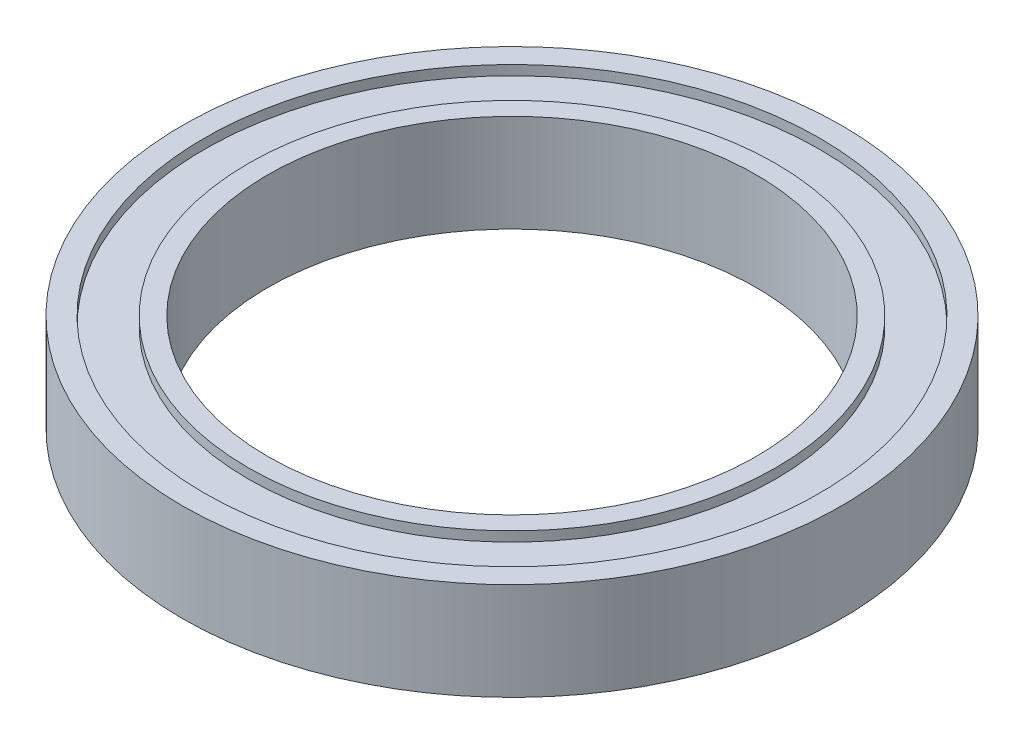
ISO-10303-21;
HEADER;
FILE_DESCRIPTION(('STEP AP214'),'2;1');
FILE_NAME('part.step','',(''),(''),'','','');
FILE_SCHEMA(('AUTOMOTIVE_DESIGN { 1 0 10303 214 1 1 1 1 }'));
ENDSEC;
DATA;
#1=APPLICATION_CONTEXT('core data for automotive mechanical design processes');
#2=APPLICATION_PROTOCOL_DEFINITION('international standard','automotive_design',2000,#1);
#3=PRODUCT_CONTEXT('',#1,'mechanical');
#4=PRODUCT('Part','Part','',(#3));
#5=PRODUCT_RELATED_PRODUCT_CATEGORY('part','',(#4));
#6=PRODUCT_DEFINITION_FORMATION('','',#4);
#7=PRODUCT_DEFINITION_CONTEXT('part definition',#1,'design');
#8=PRODUCT_DEFINITION('design','',#6,#7);
#9=PRODUCT_DEFINITION_SHAPE('','',#8);
#10=(LENGTH_UNIT() NAMED_UNIT(*) SI_UNIT(.MILLI.,.METRE.));
#11=(NAMED_UNIT(*) PLANE_ANGLE_UNIT() SI_UNIT($,.RADIAN.));
#12=(NAMED_UNIT(*) SI_UNIT($,.STERADIAN.) SOLID_ANGLE_UNIT());
#13=UNCERTAINTY_MEASURE_WITH_UNIT(LENGTH_MEASURE(1.E-05),#10,'distance_accuracy_value','');
#14=(GEOMETRIC_REPRESENTATION_CONTEXT(3) GLOBAL_UNCERTAINTY_ASSIGNED_CONTEXT((#13)) GLOBAL_UNIT_ASSIGNED_CONTEXT((#10,
#11,#12)) REPRESENTATION_CONTEXT('',''));
#15=CARTESIAN_POINT('',(0.,0.,0.));
#16=DIRECTION('',(0.,0.,1.));
#17=DIRECTION('',(1.,0.,0.));
#18=AXIS2_PLACEMENT_3D('',#15,#16,#17);
#19=CARTESIAN_POINT('',(0.,0.,0.));
#20=DIRECTION('',(0.,1.,0.));
#21=DIRECTION('',(0.,0.,1.));
#22=AXIS2_PLACEMENT_3D('',#19,#20,#21);
#23=PLANE('',#22);
#24=CARTESIAN_POINT('',(0.,0.,0.));
#25=DIRECTION('',(0.,1.,0.));
#26=DIRECTION('',(0.,0.,1.));
#27=AXIS2_PLACEMENT_3D('',#24,#25,#26);
#28=CIRCLE('',#27,10.);
#29=CARTESIAN_POINT('',(0.,0.,10.));
#30=VERTEX_POINT('',#29);
#31=EDGE_CURVE('E47',#30,#30,#28,.T.);
#32=ORIENTED_EDGE('',*,*,#31,.T.);
#33=EDGE_LOOP('',(#32));
#34=FACE_BOUND('',#33,.T.);
#35=CARTESIAN_POINT('',(0.,0.,0.));
#36=DIRECTION('',(0.,1.,0.));
#37=DIRECTION('',(0.,0.,1.));
#38=AXIS2_PLACEMENT_3D('',#35,#36,#37);
#39=CIRCLE('',#38,10.8);
#40=CARTESIAN_POINT('',(0.,0.,10.8));
#41=VERTEX_POINT('',#40);
#42=EDGE_CURVE('E71',#41,#41,#39,.T.);
#43=ORIENTED_EDGE('',*,*,#42,.F.);
#44=EDGE_LOOP('',(#43));
#45=FACE_BOUND('',#44,.T.);
#46=ADVANCED_FACE('F34',(#34,#45),#23,.F.);
#47=CARTESIAN_POINT('',(0.,4.,0.));
#48=DIRECTION('',(0.,1.,0.));
#49=DIRECTION('',(0.,0.,1.));
#50=AXIS2_PLACEMENT_3D('',#47,#48,#49);
#51=PLANE('',#50);
#52=CARTESIAN_POINT('',(0.,4.,0.));
#53=DIRECTION('',(0.,1.,0.));
#54=DIRECTION('',(0.,0.,1.));
#55=AXIS2_PLACEMENT_3D('',#52,#53,#54);
#56=CIRCLE('',#55,10.);
#57=CARTESIAN_POINT('',(0.,4.,10.));
#58=VERTEX_POINT('',#57);
#59=EDGE_CURVE('E45',#58,#58,#56,.T.);
#60=ORIENTED_EDGE('',*,*,#59,.F.);
#61=EDGE_LOOP('',(#60));
#62=FACE_BOUND('',#61,.T.);
#63=CARTESIAN_POINT('',(0.,4.,0.));
#64=DIRECTION('',(0.,1.,0.));
#65=DIRECTION('',(0.,0.,1.));
#66=AXIS2_PLACEMENT_3D('',#63,#64,#65);
#67=CIRCLE('',#66,10.8);
#68=CARTESIAN_POINT('',(0.,4.,10.8));
#69=VERTEX_POINT('',#68);
#70=EDGE_CURVE('E59',#69,#69,#67,.T.);
#71=ORIENTED_EDGE('',*,*,#70,.T.);
#72=EDGE_LOOP('',(#71));
#73=FACE_BOUND('',#72,.T.);
#74=ADVANCED_FACE('F87',(#62,#73),#51,.T.);
#75=CARTESIAN_POINT('',(0.,4.,0.));
#76=DIRECTION('',(0.,1.,0.));
#77=DIRECTION('',(0.,0.,1.));
#78=AXIS2_PLACEMENT_3D('',#75,#76,#77);
#79=CIRCLE('',#78,12.6);
#80=CARTESIAN_POINT('',(0.,4.,12.6));
#81=VERTEX_POINT('',#80);
#82=EDGE_CURVE('E53',#81,#81,#79,.T.);
#83=ORIENTED_EDGE('',*,*,#82,.F.);
#84=EDGE_LOOP('',(#83));
#85=FACE_BOUND('',#84,.T.);
#86=CARTESIAN_POINT('',(0.,4.,0.));
#87=DIRECTION('',(0.,1.,0.));
#88=DIRECTION('',(0.,0.,1.));
#89=AXIS2_PLACEMENT_3D('',#86,#87,#88);
#90=CIRCLE('',#89,13.5);
#91=CARTESIAN_POINT('',(0.,4.,13.5));
#92=VERTEX_POINT('',#91);
#93=EDGE_CURVE('E10',#92,#92,#90,.T.);
#94=ORIENTED_EDGE('',*,*,#93,.T.);
#95=EDGE_LOOP('',(#94));
#96=FACE_BOUND('',#95,.T.);
#97=ADVANCED_FACE('F93',(#85,#96),#51,.T.);
#98=CARTESIAN_POINT('',(0.,0.,0.));
#99=DIRECTION('',(0.,1.,0.));
#100=DIRECTION('',(0.,0.,1.));
#101=AXIS2_PLACEMENT_3D('',#98,#99,#100);
#102=CIRCLE('',#101,12.6);
#103=CARTESIAN_POINT('',(0.,0.,12.6));
#104=VERTEX_POINT('',#103);
#105=EDGE_CURVE('E65',#104,#104,#102,.T.);
#106=ORIENTED_EDGE('',*,*,#105,.T.);
#107=EDGE_LOOP('',(#106));
#108=FACE_BOUND('',#107,.T.);
#109=CARTESIAN_POINT('',(0.,0.,0.));
#110=DIRECTION('',(0.,1.,0.));
#111=DIRECTION('',(0.,0.,1.));
#112=AXIS2_PLACEMENT_3D('',#109,#110,#111);
#113=CIRCLE('',#112,13.5);
#114=CARTESIAN_POINT('',(0.,0.,13.5));
#115=VERTEX_POINT('',#114);
#116=EDGE_CURVE('E38',#115,#115,#113,.T.);
#117=ORIENTED_EDGE('',*,*,#116,.F.);
#118=EDGE_LOOP('',(#117));
#119=FACE_BOUND('',#118,.T.);
#120=ADVANCED_FACE('F89',(#108,#119),#23,.F.);
#121=CARTESIAN_POINT('',(0.,4.,0.));
#122=DIRECTION('',(0.,-1.,0.));
#123=DIRECTION('',(0.,0.,-1.));
#124=AXIS2_PLACEMENT_3D('',#121,#122,#123);
#125=CYLINDRICAL_SURFACE('',#124,13.5);
#126=ORIENTED_EDGE('',*,*,#93,.F.);
#127=EDGE_LOOP('',(#126));
#128=FACE_BOUND('',#127,.T.);
#129=ORIENTED_EDGE('',*,*,#116,.T.);
#130=EDGE_LOOP('',(#129));
#131=FACE_BOUND('',#130,.T.);
#132=ADVANCED_FACE('F36',(#128,#131),#125,.T.);
#133=CARTESIAN_POINT('',(0.,4.,0.));
#134=DIRECTION('',(0.,-1.,0.));
#135=DIRECTION('',(0.,0.,-1.));
#136=AXIS2_PLACEMENT_3D('',#133,#134,#135);
#137=CYLINDRICAL_SURFACE('',#136,10.);
#138=ORIENTED_EDGE('',*,*,#59,.T.);
#139=EDGE_LOOP('',(#138));
#140=FACE_BOUND('',#139,.T.);
#141=ORIENTED_EDGE('',*,*,#31,.F.);
#142=EDGE_LOOP('',(#141));
#143=FACE_BOUND('',#142,.T.);
#144=ADVANCED_FACE('F102',(#140,#143),#137,.F.);
#145=CARTESIAN_POINT('',(0.,3.6,0.));
#146=DIRECTION('',(0.,1.,0.));
#147=DIRECTION('',(0.,0.,1.));
#148=AXIS2_PLACEMENT_3D('',#145,#146,#147);
#149=CYLINDRICAL_SURFACE('',#148,12.6);
#150=CARTESIAN_POINT('',(0.,3.6,0.));
#151=DIRECTION('',(0.,1.,0.));
#152=DIRECTION('',(0.,0.,1.));
#153=AXIS2_PLACEMENT_3D('',#150,#151,#152);
#154=CIRCLE('',#153,12.6);
#155=CARTESIAN_POINT('',(0.,3.6,12.6));
#156=VERTEX_POINT('',#155);
#157=EDGE_CURVE('E50',#156,#156,#154,.T.);
#158=ORIENTED_EDGE('',*,*,#157,.F.);
#159=EDGE_LOOP('',(#158));
#160=FACE_BOUND('',#159,.T.);
#161=ORIENTED_EDGE('',*,*,#82,.T.);
#162=EDGE_LOOP('',(#161));
#163=FACE_BOUND('',#162,.T.);
#164=ADVANCED_FACE('F126',(#160,#163),#149,.F.);
#165=CARTESIAN_POINT('',(0.,3.6,0.));
#166=DIRECTION('',(0.,1.,0.));
#167=DIRECTION('',(0.,0.,1.));
#168=AXIS2_PLACEMENT_3D('',#165,#166,#167);
#169=PLANE('',#168);
#170=CARTESIAN_POINT('',(0.,3.6,0.));
#171=DIRECTION('',(0.,1.,0.));
#172=DIRECTION('',(0.,0.,1.));
#173=AXIS2_PLACEMENT_3D('',#170,#171,#172);
#174=CIRCLE('',#173,10.8);
#175=CARTESIAN_POINT('',(0.,3.6,10.8));
#176=VERTEX_POINT('',#175);
#177=EDGE_CURVE('E56',#176,#176,#174,.T.);
#178=ORIENTED_EDGE('',*,*,#177,.F.);
#179=EDGE_LOOP('',(#178));
#180=FACE_BOUND('',#179,.T.);
#181=ORIENTED_EDGE('',*,*,#157,.T.);
#182=EDGE_LOOP('',(#181));
#183=FACE_BOUND('',#182,.T.);
#184=ADVANCED_FACE('F122',(#180,#183),#169,.T.);
#185=CARTESIAN_POINT('',(0.,3.6,0.));
#186=DIRECTION('',(0.,1.,0.));
#187=DIRECTION('',(0.,0.,1.));
#188=AXIS2_PLACEMENT_3D('',#185,#186,#187);
#189=CYLINDRICAL_SURFACE('',#188,10.8);
#190=ORIENTED_EDGE('',*,*,#177,.T.);
#191=EDGE_LOOP('',(#190));
#192=FACE_BOUND('',#191,.T.);
#193=ORIENTED_EDGE('',*,*,#70,.F.);
#194=EDGE_LOOP('',(#193));
#195=FACE_BOUND('',#194,.T.);
#196=ADVANCED_FACE('F116',(#192,#195),#189,.T.);
#197=CARTESIAN_POINT('',(0.,0.4,0.));
#198=DIRECTION('',(0.,-1.,0.));
#199=DIRECTION('',(0.,0.,1.));
#200=AXIS2_PLACEMENT_3D('',#197,#198,#199);
#201=PLANE('',#200);
#202=CARTESIAN_POINT('',(0.,0.4,0.));
#203=DIRECTION('',(0.,1.,0.));
#204=DIRECTION('',(0.,0.,1.));
#205=AXIS2_PLACEMENT_3D('',#202,#203,#204);
#206=CIRCLE('',#205,12.6);
#207=CARTESIAN_POINT('',(0.,0.4,12.6));
#208=VERTEX_POINT('',#207);
#209=EDGE_CURVE('E62',#208,#208,#206,.T.);
#210=ORIENTED_EDGE('',*,*,#209,.F.);
#211=EDGE_LOOP('',(#210));
#212=FACE_BOUND('',#211,.T.);
#213=CARTESIAN_POINT('',(0.,0.4,0.));
#214=DIRECTION('',(0.,1.,0.));
#215=DIRECTION('',(0.,0.,1.));
#216=AXIS2_PLACEMENT_3D('',#213,#214,#215);
#217=CIRCLE('',#216,10.8);
#218=CARTESIAN_POINT('',(0.,0.4,10.8));
#219=VERTEX_POINT('',#218);
#220=EDGE_CURVE('E68',#219,#219,#217,.T.);
#221=ORIENTED_EDGE('',*,*,#220,.T.);
#222=EDGE_LOOP('',(#221));
#223=FACE_BOUND('',#222,.T.);
#224=ADVANCED_FACE('F77',(#212,#223),#201,.T.);
#225=CARTESIAN_POINT('',(0.,0.4,0.));
#226=DIRECTION('',(0.,-1.,0.));
#227=DIRECTION('',(0.,0.,-1.));
#228=AXIS2_PLACEMENT_3D('',#225,#226,#227);
#229=CYLINDRICAL_SURFACE('',#228,12.6);
#230=ORIENTED_EDGE('',*,*,#209,.T.);
#231=EDGE_LOOP('',(#230));
#232=FACE_BOUND('',#231,.T.);
#233=ORIENTED_EDGE('',*,*,#105,.F.);
#234=EDGE_LOOP('',(#233));
#235=FACE_BOUND('',#234,.T.);
#236=ADVANCED_FACE('F82',(#232,#235),#229,.F.);
#237=CARTESIAN_POINT('',(0.,0.4,0.));
#238=DIRECTION('',(0.,-1.,0.));
#239=DIRECTION('',(0.,0.,-1.));
#240=AXIS2_PLACEMENT_3D('',#237,#238,#239);
#241=CYLINDRICAL_SURFACE('',#240,10.8);
#242=ORIENTED_EDGE('',*,*,#220,.F.);
#243=EDGE_LOOP('',(#242));
#244=FACE_BOUND('',#243,.T.);
#245=ORIENTED_EDGE('',*,*,#42,.T.);
#246=EDGE_LOOP('',(#245));
#247=FACE_BOUND('',#246,.T.);
#248=ADVANCED_FACE('F79',(#244,#247),#241,.T.);
#249=CLOSED_SHELL('',(#46,#74,#97,#120,#132,#144,#164,#184,#196,#224,#236,#248));
#250=MANIFOLD_SOLID_BREP('B2',#249);
#251=ADVANCED_BREP_SHAPE_REPRESENTATION('',(#18,#250),#14);
#252=SHAPE_DEFINITION_REPRESENTATION(#9,#251);
ENDSEC;
END-ISO-10303-21;
